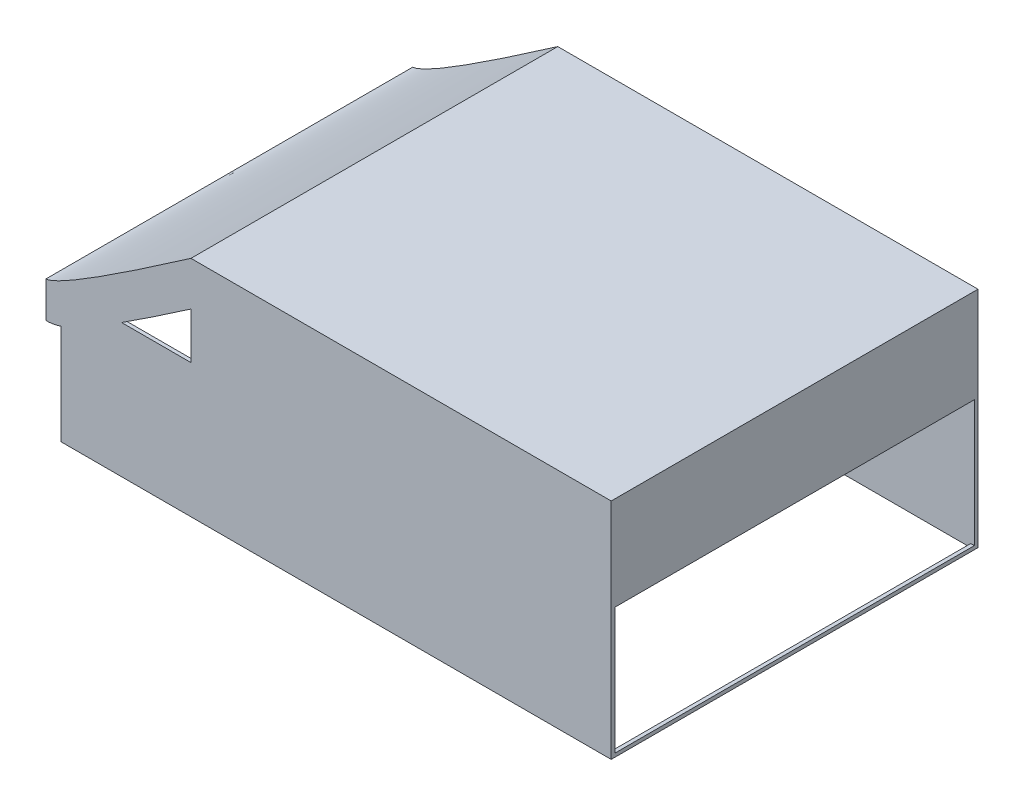
ISO-10303-21;
HEADER;
FILE_DESCRIPTION(('STEP AP214'),'2;1');
FILE_NAME('part.step','',(''),(''),'','','');
FILE_SCHEMA(('AUTOMOTIVE_DESIGN { 1 0 10303 214 1 1 1 1 }'));
ENDSEC;
DATA;
#1=APPLICATION_CONTEXT('core data for automotive mechanical design processes');
#2=APPLICATION_PROTOCOL_DEFINITION('international standard','automotive_design',2000,#1);
#3=PRODUCT_CONTEXT('',#1,'mechanical');
#4=PRODUCT('Part','Part','',(#3));
#5=PRODUCT_RELATED_PRODUCT_CATEGORY('part','',(#4));
#6=PRODUCT_DEFINITION_FORMATION('','',#4);
#7=PRODUCT_DEFINITION_CONTEXT('part definition',#1,'design');
#8=PRODUCT_DEFINITION('design','',#6,#7);
#9=PRODUCT_DEFINITION_SHAPE('','',#8);
#10=(LENGTH_UNIT() NAMED_UNIT(*) SI_UNIT(.MILLI.,.METRE.));
#11=(NAMED_UNIT(*) PLANE_ANGLE_UNIT() SI_UNIT($,.RADIAN.));
#12=(NAMED_UNIT(*) SI_UNIT($,.STERADIAN.) SOLID_ANGLE_UNIT());
#13=UNCERTAINTY_MEASURE_WITH_UNIT(LENGTH_MEASURE(1.E-05),#10,'distance_accuracy_value','');
#14=(GEOMETRIC_REPRESENTATION_CONTEXT(3) GLOBAL_UNCERTAINTY_ASSIGNED_CONTEXT((#13)) GLOBAL_UNIT_ASSIGNED_CONTEXT((#10,
#11,#12)) REPRESENTATION_CONTEXT('',''));
#15=CARTESIAN_POINT('',(0.,0.,0.));
#16=DIRECTION('',(0.,0.,1.));
#17=DIRECTION('',(1.,0.,0.));
#18=AXIS2_PLACEMENT_3D('',#15,#16,#17);
#19=CARTESIAN_POINT('',(-37.0766872794392,33.5,101.6));
#20=CARTESIAN_POINT('',(-42.7125032350059,29.6027559414298,101.6));
#21=CARTESIAN_POINT('',(-47.7401015171369,26.184011055158,101.6));
#22=CARTESIAN_POINT('',(-56.6002946408036,20.2910710982014,101.6));
#23=CARTESIAN_POINT('',(-60.4301900378997,17.8180585646791,101.6));
#24=CARTESIAN_POINT('',(-65.3309971448437,14.789830610659,101.6));
#25=CARTESIAN_POINT('',(-66.8241610539171,13.8937812196301,101.6));
#26=CARTESIAN_POINT('',(-69.5608772965481,12.3148053504962,101.6));
#27=CARTESIAN_POINT('',(-70.8015703462248,11.6324838821223,101.6));
#28=CARTESIAN_POINT('',(-72.5425145499101,10.7455673945844,101.6));
#29=CARTESIAN_POINT('',(-73.1032765211819,10.4724795735658,101.6));
#30=CARTESIAN_POINT('',(-74.2188237703371,9.96370439150966,101.6));
#31=CARTESIAN_POINT('',(-74.7719962388831,9.72783777312327,101.6));
#32=CARTESIAN_POINT('',(-75.6545097705938,9.39506547904827,101.6));
#33=CARTESIAN_POINT('',(-75.9579104070643,9.2876095564248,101.6));
#34=CARTESIAN_POINT('',(-76.6041667579753,9.07990325523925,101.6));
#35=CARTESIAN_POINT('',(-76.9466771282731,8.97943976358308,101.6));
#36=CARTESIAN_POINT('',(-77.7076101708116,8.79063089014684,101.6));
#37=CARTESIAN_POINT('',(-78.1254229662636,8.70154924601827,101.6));
#38=CARTESIAN_POINT('',(-79.1033064111244,8.55745716267692,101.6));
#39=CARTESIAN_POINT('',(-79.6630664683787,8.49999756803788,101.6));
#40=CARTESIAN_POINT('',(-80.3510854463625,8.4999973947017,101.6));
#41=B_SPLINE_CURVE_WITH_KNOTS('',3,(#19,#20,#21,#22,#23,#24,#25,#26,#27,#28,#29,#30,#31,#32,#33,
#34,#35,#36,#37,#38,#39,#40),.UNSPECIFIED.,.F.,.F.,(4,2,2,2,2,2,2,2,2,2,4),(0.,0.25,
0.499999999999999,0.624999999999999,0.749999999999999,0.812499999999999,0.874999999999999,
0.906249999999999,0.9375,0.96875,1.),.UNSPECIFIED.);
#42=DIRECTION('',(0.,0.,-1.));
#43=VECTOR('',#42,1.);
#44=SURFACE_OF_LINEAR_EXTRUSION('',#41,#43);
#45=CARTESIAN_POINT('',(-37.0766872794392,33.5,0.));
#46=CARTESIAN_POINT('',(-42.7125032350059,29.6027559414298,0.));
#47=CARTESIAN_POINT('',(-47.7401015171369,26.184011055158,0.));
#48=CARTESIAN_POINT('',(-56.6002946408036,20.2910710982014,0.));
#49=CARTESIAN_POINT('',(-60.4301900378997,17.8180585646791,0.));
#50=CARTESIAN_POINT('',(-65.3309971448437,14.789830610659,0.));
#51=CARTESIAN_POINT('',(-66.8241610539171,13.8937812196301,0.));
#52=CARTESIAN_POINT('',(-69.5608772965481,12.3148053504962,0.));
#53=CARTESIAN_POINT('',(-70.8015703462248,11.6324838821223,0.));
#54=CARTESIAN_POINT('',(-72.5425145499101,10.7455673945844,0.));
#55=CARTESIAN_POINT('',(-73.1032765211819,10.4724795735658,0.));
#56=CARTESIAN_POINT('',(-74.2188237703371,9.96370439150966,0.));
#57=CARTESIAN_POINT('',(-74.7719962388831,9.72783777312327,0.));
#58=CARTESIAN_POINT('',(-75.6545097705938,9.39506547904827,0.));
#59=CARTESIAN_POINT('',(-75.9579104070643,9.2876095564248,0.));
#60=CARTESIAN_POINT('',(-76.6041667579753,9.07990325523925,0.));
#61=CARTESIAN_POINT('',(-76.9466771282731,8.97943976358308,0.));
#62=CARTESIAN_POINT('',(-77.7076101708116,8.79063089014684,0.));
#63=CARTESIAN_POINT('',(-78.1254229662636,8.70154924601827,0.));
#64=CARTESIAN_POINT('',(-79.1033064111244,8.55745716267692,0.));
#65=CARTESIAN_POINT('',(-79.6630664683787,8.49999756803788,0.));
#66=CARTESIAN_POINT('',(-80.3510854463625,8.4999973947017,0.));
#67=B_SPLINE_CURVE_WITH_KNOTS('',3,(#45,#46,#47,#48,#49,#50,#51,#52,#53,#54,#55,#56,#57,#58,#59,
#60,#61,#62,#63,#64,#65,#66),.UNSPECIFIED.,.F.,.F.,(4,2,2,2,2,2,2,2,2,2,4),(0.,0.25,
0.499999999999999,0.624999999999999,0.749999999999999,0.812499999999999,0.874999999999999,
0.906249999999999,0.9375,0.96875,1.),.UNSPECIFIED.);
#68=CARTESIAN_POINT('',(-40.2031351826455,31.3442159922802,0.));
#69=VERTEX_POINT('',#68);
#70=CARTESIAN_POINT('',(-59.4122941054104,18.4999999999916,0.));
#71=VERTEX_POINT('',#70);
#72=EDGE_CURVE('E190',#69,#71,#67,.T.);
#73=ORIENTED_EDGE('',*,*,#72,.F.);
#74=DIRECTION('',(0.,0.,-1.));
#75=VECTOR('',#74,1.);
#76=CARTESIAN_POINT('',(-40.2031351826455,31.344215985583,101.6));
#77=LINE('',#76,#75);
#78=CARTESIAN_POINT('',(-40.2031351826455,31.3442159922802,101.6));
#79=VERTEX_POINT('',#78);
#80=EDGE_CURVE('E200',#69,#79,#77,.F.);
#81=ORIENTED_EDGE('',*,*,#80,.T.);
#82=CARTESIAN_POINT('',(-59.4122941054104,18.4999999999916,101.6));
#83=VERTEX_POINT('',#82);
#84=EDGE_CURVE('E430',#79,#83,#41,.T.);
#85=ORIENTED_EDGE('',*,*,#84,.T.);
#86=DIRECTION('',(0.,0.,-1.));
#87=VECTOR('',#86,1.);
#88=CARTESIAN_POINT('',(-59.4122941053973,18.5,101.6));
#89=LINE('',#88,#87);
#90=CARTESIAN_POINT('',(-59.4122941054104,18.5,100.6));
#91=VERTEX_POINT('',#90);
#92=EDGE_CURVE('E61',#91,#83,#89,.F.);
#93=ORIENTED_EDGE('',*,*,#92,.F.);
#94=CARTESIAN_POINT('',(-37.0766872794392,33.5,100.6));
#95=CARTESIAN_POINT('',(-42.7125032350059,29.6027559414298,100.6));
#96=CARTESIAN_POINT('',(-47.7401015171369,26.184011055158,100.6));
#97=CARTESIAN_POINT('',(-56.6002946408036,20.2910710982014,100.6));
#98=CARTESIAN_POINT('',(-60.4301900378997,17.8180585646791,100.6));
#99=CARTESIAN_POINT('',(-65.3309971448437,14.789830610659,100.6));
#100=CARTESIAN_POINT('',(-66.8241610539171,13.8937812196301,100.6));
#101=CARTESIAN_POINT('',(-69.5608772965481,12.3148053504962,100.6));
#102=CARTESIAN_POINT('',(-70.8015703462248,11.6324838821223,100.6));
#103=CARTESIAN_POINT('',(-72.5425145499101,10.7455673945844,100.6));
#104=CARTESIAN_POINT('',(-73.1032765211819,10.4724795735658,100.6));
#105=CARTESIAN_POINT('',(-74.2188237703371,9.96370439150966,100.6));
#106=CARTESIAN_POINT('',(-74.7719962388831,9.72783777312327,100.6));
#107=CARTESIAN_POINT('',(-75.6545097705938,9.39506547904827,100.6));
#108=CARTESIAN_POINT('',(-75.9579104070643,9.2876095564248,100.6));
#109=CARTESIAN_POINT('',(-76.6041667579753,9.07990325523925,100.6));
#110=CARTESIAN_POINT('',(-76.9466771282731,8.97943976358308,100.6));
#111=CARTESIAN_POINT('',(-77.7076101708116,8.79063089014684,100.6));
#112=CARTESIAN_POINT('',(-78.1254229662636,8.70154924601827,100.6));
#113=CARTESIAN_POINT('',(-79.1033064111244,8.55745716267692,100.6));
#114=CARTESIAN_POINT('',(-79.6630664683787,8.49999756803788,100.6));
#115=CARTESIAN_POINT('',(-80.3510854463625,8.4999973947017,100.6));
#116=B_SPLINE_CURVE_WITH_KNOTS('',3,(#94,#95,#96,#97,#98,#99,#100,#101,#102,#103,#104,#105,#106,
#107,#108,#109,#110,#111,#112,#113,#114,#115),.UNSPECIFIED.,.F.,.F.,(4,2,2,2,2,2,2,2,2,2,4),(0.,
0.25,0.499999999999999,0.624999999999999,0.749999999999999,0.812499999999999,0.874999999999999,
0.906249999999999,0.9375,0.96875,1.),.UNSPECIFIED.);
#117=CARTESIAN_POINT('',(-76.1999999997802,9.21001065409263,100.6));
#118=VERTEX_POINT('',#117);
#119=EDGE_CURVE('E11',#118,#91,#116,.F.);
#120=ORIENTED_EDGE('',*,*,#119,.F.);
#121=DIRECTION('',(0.,0.,-1.));
#122=VECTOR('',#121,1.);
#123=CARTESIAN_POINT('',(-76.1999999999956,9.2100106540223,101.6));
#124=LINE('',#123,#122);
#125=CARTESIAN_POINT('',(-76.1999999997802,9.21001065409262,101.6));
#126=VERTEX_POINT('',#125);
#127=EDGE_CURVE('E249',#126,#118,#124,.T.);
#128=ORIENTED_EDGE('',*,*,#127,.F.);
#129=CARTESIAN_POINT('',(-80.3510854463625,8.4999973947017,101.6));
#130=VERTEX_POINT('',#129);
#131=EDGE_CURVE('E196',#126,#130,#41,.T.);
#132=ORIENTED_EDGE('',*,*,#131,.T.);
#133=DIRECTION('',(0.,0.,-1.));
#134=VECTOR('',#133,1.);
#135=CARTESIAN_POINT('',(-80.3510854463625,8.4999973947017,101.6));
#136=LINE('',#135,#134);
#137=CARTESIAN_POINT('',(-80.3510854463625,8.4999973947017,0.));
#138=VERTEX_POINT('',#137);
#139=EDGE_CURVE('E244',#130,#138,#136,.T.);
#140=ORIENTED_EDGE('',*,*,#139,.T.);
#141=CARTESIAN_POINT('',(-76.1999999997802,9.21001065409262,0.));
#142=VERTEX_POINT('',#141);
#143=EDGE_CURVE('E205',#142,#138,#67,.T.);
#144=ORIENTED_EDGE('',*,*,#143,.F.);
#145=CARTESIAN_POINT('',(-76.2,9.21001065409263,1.));
#146=VERTEX_POINT('',#145);
#147=EDGE_CURVE('E54',#146,#142,#124,.T.);
#148=ORIENTED_EDGE('',*,*,#147,.F.);
#149=CARTESIAN_POINT('',(-37.0766872794392,33.5,1.));
#150=CARTESIAN_POINT('',(-42.7125032350059,29.6027559414298,1.));
#151=CARTESIAN_POINT('',(-47.7401015171369,26.184011055158,1.));
#152=CARTESIAN_POINT('',(-56.6002946408036,20.2910710982014,1.));
#153=CARTESIAN_POINT('',(-60.4301900378997,17.8180585646791,1.));
#154=CARTESIAN_POINT('',(-65.3309971448437,14.789830610659,1.));
#155=CARTESIAN_POINT('',(-66.8241610539171,13.8937812196301,1.));
#156=CARTESIAN_POINT('',(-69.5608772965481,12.3148053504962,1.));
#157=CARTESIAN_POINT('',(-70.8015703462248,11.6324838821223,1.));
#158=CARTESIAN_POINT('',(-72.5425145499101,10.7455673945844,1.));
#159=CARTESIAN_POINT('',(-73.1032765211819,10.4724795735658,1.));
#160=CARTESIAN_POINT('',(-74.2188237703371,9.96370439150966,1.));
#161=CARTESIAN_POINT('',(-74.7719962388831,9.72783777312327,1.));
#162=CARTESIAN_POINT('',(-75.6545097705938,9.39506547904827,1.));
#163=CARTESIAN_POINT('',(-75.9579104070643,9.2876095564248,1.));
#164=CARTESIAN_POINT('',(-76.6041667579753,9.07990325523925,1.));
#165=CARTESIAN_POINT('',(-76.9466771282731,8.97943976358308,1.));
#166=CARTESIAN_POINT('',(-77.7076101708116,8.79063089014684,1.));
#167=CARTESIAN_POINT('',(-78.1254229662636,8.70154924601827,1.));
#168=CARTESIAN_POINT('',(-79.1033064111244,8.55745716267692,1.));
#169=CARTESIAN_POINT('',(-79.6630664683787,8.49999756803788,1.));
#170=CARTESIAN_POINT('',(-80.3510854463625,8.4999973947017,1.));
#171=B_SPLINE_CURVE_WITH_KNOTS('',3,(#149,#150,#151,#152,#153,#154,#155,#156,#157,#158,#159,
#160,#161,#162,#163,#164,#165,#166,#167,#168,#169,#170),.UNSPECIFIED.,.F.,.F.,(4,2,2,2,2,2,2,2,
2,2,4),(0.,0.25,0.499999999999999,0.624999999999999,0.749999999999999,0.812499999999999,
0.874999999999999,0.906249999999999,0.9375,0.96875,1.),.UNSPECIFIED.);
#172=CARTESIAN_POINT('',(-59.4122941054104,18.4999999999916,1.));
#173=VERTEX_POINT('',#172);
#174=EDGE_CURVE('E252',#173,#146,#171,.T.);
#175=ORIENTED_EDGE('',*,*,#174,.F.);
#176=EDGE_CURVE('E208',#71,#173,#89,.F.);
#177=ORIENTED_EDGE('',*,*,#176,.F.);
#178=EDGE_LOOP('',(#73,#81,#85,#93,#120,#128,#132,#140,#144,#148,#175,#177));
#179=FACE_BOUND('',#178,.T.);
#180=ADVANCED_FACE('F37',(#179),#44,.T.);
#181=CARTESIAN_POINT('',(76.2,18.5,101.6));
#182=DIRECTION('',(0.,1.,0.));
#183=DIRECTION('',(0.,0.,1.));
#184=AXIS2_PLACEMENT_3D('',#181,#182,#183);
#185=PLANE('',#184);
#186=DIRECTION('',(0.,0.,-1.));
#187=VECTOR('',#186,1.);
#188=CARTESIAN_POINT('',(-40.2031351826455,18.5,101.6));
#189=LINE('',#188,#187);
#190=CARTESIAN_POINT('',(-40.2031351826455,18.5,100.6));
#191=VERTEX_POINT('',#190);
#192=CARTESIAN_POINT('',(-40.2031351826455,18.5,1.));
#193=VERTEX_POINT('',#192);
#194=EDGE_CURVE('E233',#191,#193,#189,.T.);
#195=ORIENTED_EDGE('',*,*,#194,.T.);
#196=DIRECTION('',(-1.,0.,0.));
#197=VECTOR('',#196,1.);
#198=CARTESIAN_POINT('',(75.2,18.5,1.));
#199=LINE('',#198,#197);
#200=CARTESIAN_POINT('',(75.2,18.5,0.999999999999996));
#201=VERTEX_POINT('',#200);
#202=EDGE_CURVE('E277',#201,#193,#199,.T.);
#203=ORIENTED_EDGE('',*,*,#202,.F.);
#204=DIRECTION('',(0.,0.,-1.));
#205=VECTOR('',#204,1.);
#206=CARTESIAN_POINT('',(75.2,18.5,1.));
#207=LINE('',#206,#205);
#208=CARTESIAN_POINT('',(75.2,18.5,100.6));
#209=VERTEX_POINT('',#208);
#210=EDGE_CURVE('E273',#209,#201,#207,.T.);
#211=ORIENTED_EDGE('',*,*,#210,.F.);
#212=DIRECTION('',(-1.,0.,0.));
#213=VECTOR('',#212,1.);
#214=CARTESIAN_POINT('',(76.2,18.5,100.6));
#215=LINE('',#214,#213);
#216=EDGE_CURVE('E232',#209,#191,#215,.T.);
#217=ORIENTED_EDGE('',*,*,#216,.T.);
#218=EDGE_LOOP('',(#195,#203,#211,#217));
#219=FACE_BOUND('',#218,.T.);
#220=ADVANCED_FACE('F402',(#219),#185,.F.);
#221=CARTESIAN_POINT('',(-40.2031351826455,28.5,101.6));
#222=DIRECTION('',(1.,0.,0.));
#223=DIRECTION('',(0.,0.,-1.));
#224=AXIS2_PLACEMENT_3D('',#221,#222,#223);
#225=PLANE('',#224);
#226=DIRECTION('',(0.,-1.,0.));
#227=VECTOR('',#226,1.);
#228=CARTESIAN_POINT('',(-40.2031351826455,28.5,0.));
#229=LINE('',#228,#227);
#230=CARTESIAN_POINT('',(-40.2031351826455,18.5,0.));
#231=VERTEX_POINT('',#230);
#232=EDGE_CURVE('E185',#69,#231,#229,.T.);
#233=ORIENTED_EDGE('',*,*,#232,.T.);
#234=EDGE_CURVE('E234',#193,#231,#189,.T.);
#235=ORIENTED_EDGE('',*,*,#234,.F.);
#236=ORIENTED_EDGE('',*,*,#194,.F.);
#237=CARTESIAN_POINT('',(-40.2031351826455,18.5,101.6));
#238=VERTEX_POINT('',#237);
#239=EDGE_CURVE('E229',#238,#191,#189,.T.);
#240=ORIENTED_EDGE('',*,*,#239,.F.);
#241=DIRECTION('',(0.,-1.,0.));
#242=VECTOR('',#241,1.);
#243=CARTESIAN_POINT('',(-40.2031351826455,28.5,101.6));
#244=LINE('',#243,#242);
#245=EDGE_CURVE('E203',#79,#238,#244,.T.);
#246=ORIENTED_EDGE('',*,*,#245,.F.);
#247=ORIENTED_EDGE('',*,*,#80,.F.);
#248=EDGE_LOOP('',(#233,#235,#236,#240,#246,#247));
#249=FACE_BOUND('',#248,.T.);
#250=ADVANCED_FACE('F201',(#249),#225,.F.);
#251=CARTESIAN_POINT('',(76.2,43.5,101.6));
#252=DIRECTION('',(0.,-1.,0.));
#253=DIRECTION('',(0.,0.,-1.));
#254=AXIS2_PLACEMENT_3D('',#251,#252,#253);
#255=PLANE('',#254);
#256=DIRECTION('',(-1.,0.,0.));
#257=VECTOR('',#256,1.);
#258=CARTESIAN_POINT('',(76.2,43.5,0.));
#259=LINE('',#258,#257);
#260=CARTESIAN_POINT('',(76.2,43.5,0.));
#261=VERTEX_POINT('',#260);
#262=CARTESIAN_POINT('',(-40.2031351826455,43.5,0.));
#263=VERTEX_POINT('',#262);
#264=EDGE_CURVE('E197',#261,#263,#259,.T.);
#265=ORIENTED_EDGE('',*,*,#264,.T.);
#266=DIRECTION('',(0.,0.,-1.));
#267=VECTOR('',#266,1.);
#268=CARTESIAN_POINT('',(-40.2031351826455,43.5,101.6));
#269=LINE('',#268,#267);
#270=CARTESIAN_POINT('',(-40.2031351826455,43.5,101.6));
#271=VERTEX_POINT('',#270);
#272=EDGE_CURVE('E238',#271,#263,#269,.T.);
#273=ORIENTED_EDGE('',*,*,#272,.F.);
#274=DIRECTION('',(-1.,0.,0.));
#275=VECTOR('',#274,1.);
#276=CARTESIAN_POINT('',(76.2,43.5,101.6));
#277=LINE('',#276,#275);
#278=CARTESIAN_POINT('',(76.2,43.5,101.6));
#279=VERTEX_POINT('',#278);
#280=EDGE_CURVE('E445',#279,#271,#277,.T.);
#281=ORIENTED_EDGE('',*,*,#280,.F.);
#282=DIRECTION('',(0.,0.,-1.));
#283=VECTOR('',#282,1.);
#284=CARTESIAN_POINT('',(76.2,43.5,101.6));
#285=LINE('',#284,#283);
#286=EDGE_CURVE('E235',#279,#261,#285,.T.);
#287=ORIENTED_EDGE('',*,*,#286,.T.);
#288=EDGE_LOOP('',(#265,#273,#281,#287));
#289=FACE_BOUND('',#288,.T.);
#290=ADVANCED_FACE('F452',(#289),#255,.F.);
#291=CARTESIAN_POINT('',(-40.2031351826455,43.5,101.6));
#292=CARTESIAN_POINT('',(-76.2000022454759,18.4999984405059,101.6));
#293=CARTESIAN_POINT('',(-80.3510879657142,18.4999973947014,101.6));
#294=B_SPLINE_CURVE_WITH_KNOTS('',2,(#291,#292,#293),.UNSPECIFIED.,.F.,.F.,(3,3),(0.,1.),.UNSPECIFIED.);
#295=DIRECTION('',(0.,0.,-1.));
#296=VECTOR('',#295,1.);
#297=SURFACE_OF_LINEAR_EXTRUSION('',#294,#296);
#298=CARTESIAN_POINT('',(-40.2031351826455,43.5,0.));
#299=CARTESIAN_POINT('',(-76.2000022454759,18.4999984405059,0.));
#300=CARTESIAN_POINT('',(-80.3510879657142,18.4999973947014,0.));
#301=B_SPLINE_CURVE_WITH_KNOTS('',2,(#298,#299,#300),.UNSPECIFIED.,.F.,.F.,(3,3),(0.,1.),.UNSPECIFIED.);
#302=CARTESIAN_POINT('',(-80.3510879657142,18.4999973947014,0.));
#303=VERTEX_POINT('',#302);
#304=EDGE_CURVE('E212',#263,#303,#301,.T.);
#305=ORIENTED_EDGE('',*,*,#304,.T.);
#306=DIRECTION('',(0.,0.,-1.));
#307=VECTOR('',#306,1.);
#308=CARTESIAN_POINT('',(-80.3510879657142,18.4999973947014,101.6));
#309=LINE('',#308,#307);
#310=CARTESIAN_POINT('',(-80.3510879657142,18.4999973947014,101.6));
#311=VERTEX_POINT('',#310);
#312=EDGE_CURVE('E241',#311,#303,#309,.T.);
#313=ORIENTED_EDGE('',*,*,#312,.F.);
#314=EDGE_CURVE('E441',#271,#311,#294,.T.);
#315=ORIENTED_EDGE('',*,*,#314,.F.);
#316=ORIENTED_EDGE('',*,*,#272,.T.);
#317=EDGE_LOOP('',(#305,#313,#315,#316));
#318=FACE_BOUND('',#317,.T.);
#319=ADVANCED_FACE('F449',(#318),#297,.F.);
#320=CARTESIAN_POINT('',(-80.3510879657142,18.4999973947014,101.6));
#321=DIRECTION('',(0.999999999999968,2.51935174111484E-07,0.));
#322=DIRECTION('',(-2.51935174111484E-07,0.999999999999968,0.));
#323=AXIS2_PLACEMENT_3D('',#320,#321,#322);
#324=PLANE('',#323);
#325=DIRECTION('',(2.51935174111484E-07,-0.999999999999968,0.));
#326=VECTOR('',#325,1.);
#327=CARTESIAN_POINT('',(-80.3510879657142,18.4999973947014,0.));
#328=LINE('',#327,#326);
#329=EDGE_CURVE('E209',#303,#138,#328,.T.);
#330=ORIENTED_EDGE('',*,*,#329,.T.);
#331=ORIENTED_EDGE('',*,*,#139,.F.);
#332=DIRECTION('',(2.51935174111484E-07,-0.999999999999968,0.));
#333=VECTOR('',#332,1.);
#334=CARTESIAN_POINT('',(-80.3510879657142,18.4999973947014,101.6));
#335=LINE('',#334,#333);
#336=EDGE_CURVE('E435',#311,#130,#335,.T.);
#337=ORIENTED_EDGE('',*,*,#336,.F.);
#338=ORIENTED_EDGE('',*,*,#312,.T.);
#339=EDGE_LOOP('',(#330,#331,#337,#338));
#340=FACE_BOUND('',#339,.T.);
#341=ADVANCED_FACE('F427',(#340),#324,.F.);
#342=CARTESIAN_POINT('',(-76.2,18.5,101.6));
#343=DIRECTION('',(0.,-1.,0.));
#344=DIRECTION('',(0.,0.,-1.));
#345=AXIS2_PLACEMENT_3D('',#342,#343,#344);
#346=PLANE('',#345);
#347=DIRECTION('',(-1.,0.,0.));
#348=VECTOR('',#347,1.);
#349=CARTESIAN_POINT('',(-76.2,18.5,0.));
#350=LINE('',#349,#348);
#351=EDGE_CURVE('E193',#231,#71,#350,.T.);
#352=ORIENTED_EDGE('',*,*,#351,.T.);
#353=ORIENTED_EDGE('',*,*,#176,.T.);
#354=EDGE_CURVE('E276',#193,#173,#199,.T.);
#355=ORIENTED_EDGE('',*,*,#354,.F.);
#356=ORIENTED_EDGE('',*,*,#234,.T.);
#357=EDGE_LOOP('',(#352,#353,#355,#356));
#358=FACE_BOUND('',#357,.T.);
#359=ADVANCED_FACE('F401',(#358),#346,.F.);
#360=DIRECTION('',(1.,0.,0.));
#361=VECTOR('',#360,1.);
#362=CARTESIAN_POINT('',(75.2,18.5,100.6));
#363=LINE('',#362,#361);
#364=EDGE_CURVE('E263',#91,#191,#363,.T.);
#365=ORIENTED_EDGE('',*,*,#364,.F.);
#366=ORIENTED_EDGE('',*,*,#92,.T.);
#367=DIRECTION('',(-1.,0.,0.));
#368=VECTOR('',#367,1.);
#369=CARTESIAN_POINT('',(-76.2,18.5,101.6));
#370=LINE('',#369,#368);
#371=EDGE_CURVE('E336',#238,#83,#370,.T.);
#372=ORIENTED_EDGE('',*,*,#371,.F.);
#373=ORIENTED_EDGE('',*,*,#239,.T.);
#374=EDGE_LOOP('',(#365,#366,#372,#373));
#375=FACE_BOUND('',#374,.T.);
#376=ADVANCED_FACE('F394',(#375),#346,.F.);
#377=CARTESIAN_POINT('',(76.2,17.5,1.));
#378=DIRECTION('',(0.,1.,0.));
#379=DIRECTION('',(0.,0.,1.));
#380=AXIS2_PLACEMENT_3D('',#377,#378,#379);
#381=PLANE('',#380);
#382=DIRECTION('',(-1.,0.,0.));
#383=VECTOR('',#382,1.);
#384=CARTESIAN_POINT('',(76.2,17.5,100.6));
#385=LINE('',#384,#383);
#386=CARTESIAN_POINT('',(76.2,17.5,100.6));
#387=VERTEX_POINT('',#386);
#388=CARTESIAN_POINT('',(75.2,17.5,100.6));
#389=VERTEX_POINT('',#388);
#390=EDGE_CURVE('E320',#387,#389,#385,.T.);
#391=ORIENTED_EDGE('',*,*,#390,.T.);
#392=DIRECTION('',(0.,0.,-1.));
#393=VECTOR('',#392,1.);
#394=CARTESIAN_POINT('',(75.2,17.5,1.));
#395=LINE('',#394,#393);
#396=CARTESIAN_POINT('',(75.2,17.5,1.));
#397=VERTEX_POINT('',#396);
#398=EDGE_CURVE('E284',#389,#397,#395,.T.);
#399=ORIENTED_EDGE('',*,*,#398,.T.);
#400=DIRECTION('',(-1.,0.,0.));
#401=VECTOR('',#400,1.);
#402=CARTESIAN_POINT('',(76.2,17.5,1.));
#403=LINE('',#402,#401);
#404=CARTESIAN_POINT('',(76.2,17.5,1.));
#405=VERTEX_POINT('',#404);
#406=EDGE_CURVE('E316',#405,#397,#403,.T.);
#407=ORIENTED_EDGE('',*,*,#406,.F.);
#408=DIRECTION('',(0.,0.,-1.));
#409=VECTOR('',#408,1.);
#410=CARTESIAN_POINT('',(76.2,17.5,1.));
#411=LINE('',#410,#409);
#412=EDGE_CURVE('E306',#387,#405,#411,.T.);
#413=ORIENTED_EDGE('',*,*,#412,.F.);
#414=EDGE_LOOP('',(#391,#399,#407,#413));
#415=FACE_BOUND('',#414,.T.);
#416=ADVANCED_FACE('F407',(#415),#381,.F.);
#417=CARTESIAN_POINT('',(76.2,-17.5,1.));
#418=DIRECTION('',(0.,-1.,0.));
#419=DIRECTION('',(0.,0.,-1.));
#420=AXIS2_PLACEMENT_3D('',#417,#418,#419);
#421=PLANE('',#420);
#422=DIRECTION('',(-1.,0.,0.));
#423=VECTOR('',#422,1.);
#424=CARTESIAN_POINT('',(76.2,-17.5,1.));
#425=LINE('',#424,#423);
#426=CARTESIAN_POINT('',(76.2,-17.5,1.));
#427=VERTEX_POINT('',#426);
#428=CARTESIAN_POINT('',(75.2,-17.5,1.));
#429=VERTEX_POINT('',#428);
#430=EDGE_CURVE('E327',#427,#429,#425,.T.);
#431=ORIENTED_EDGE('',*,*,#430,.T.);
#432=DIRECTION('',(0.,0.,1.));
#433=VECTOR('',#432,1.);
#434=CARTESIAN_POINT('',(75.2,-17.5,1.));
#435=LINE('',#434,#433);
#436=CARTESIAN_POINT('',(75.2,-17.5,100.6));
#437=VERTEX_POINT('',#436);
#438=EDGE_CURVE('E47',#429,#437,#435,.T.);
#439=ORIENTED_EDGE('',*,*,#438,.T.);
#440=DIRECTION('',(-1.,0.,0.));
#441=VECTOR('',#440,1.);
#442=CARTESIAN_POINT('',(76.2,-17.5,100.6));
#443=LINE('',#442,#441);
#444=CARTESIAN_POINT('',(76.2,-17.5,100.6));
#445=VERTEX_POINT('',#444);
#446=EDGE_CURVE('E323',#445,#437,#443,.T.);
#447=ORIENTED_EDGE('',*,*,#446,.F.);
#448=DIRECTION('',(0.,0.,1.));
#449=VECTOR('',#448,1.);
#450=CARTESIAN_POINT('',(76.2,-17.5,1.));
#451=LINE('',#450,#449);
#452=EDGE_CURVE('E299',#427,#445,#451,.T.);
#453=ORIENTED_EDGE('',*,*,#452,.F.);
#454=EDGE_LOOP('',(#431,#439,#447,#453));
#455=FACE_BOUND('',#454,.T.);
#456=ADVANCED_FACE('F357',(#455),#421,.F.);
#457=CARTESIAN_POINT('',(-76.2,18.5,101.6));
#458=DIRECTION('',(1.,0.,0.));
#459=DIRECTION('',(0.,0.,-1.));
#460=AXIS2_PLACEMENT_3D('',#457,#458,#459);
#461=PLANE('',#460);
#462=DIRECTION('',(0.,-1.,0.));
#463=VECTOR('',#462,1.);
#464=CARTESIAN_POINT('',(-76.2,18.5,101.6));
#465=LINE('',#464,#463);
#466=CARTESIAN_POINT('',(-76.2,-18.5,101.6));
#467=VERTEX_POINT('',#466);
#468=EDGE_CURVE('E330',#126,#467,#465,.T.);
#469=ORIENTED_EDGE('',*,*,#468,.F.);
#470=ORIENTED_EDGE('',*,*,#127,.T.);
#471=DIRECTION('',(0.,1.,0.));
#472=VECTOR('',#471,1.);
#473=CARTESIAN_POINT('',(-76.2,17.5,100.6));
#474=LINE('',#473,#472);
#475=CARTESIAN_POINT('',(-76.2,-17.5,100.6));
#476=VERTEX_POINT('',#475);
#477=EDGE_CURVE('E300',#476,#118,#474,.T.);
#478=ORIENTED_EDGE('',*,*,#477,.F.);
#479=DIRECTION('',(0.,0.,1.));
#480=VECTOR('',#479,1.);
#481=CARTESIAN_POINT('',(-76.2,-17.5,1.));
#482=LINE('',#481,#480);
#483=CARTESIAN_POINT('',(-76.2,-17.5,1.));
#484=VERTEX_POINT('',#483);
#485=EDGE_CURVE('E311',#484,#476,#482,.T.);
#486=ORIENTED_EDGE('',*,*,#485,.F.);
#487=DIRECTION('',(0.,-1.,0.));
#488=VECTOR('',#487,1.);
#489=CARTESIAN_POINT('',(-76.2,17.5,1.));
#490=LINE('',#489,#488);
#491=EDGE_CURVE('E295',#146,#484,#490,.T.);
#492=ORIENTED_EDGE('',*,*,#491,.F.);
#493=ORIENTED_EDGE('',*,*,#147,.T.);
#494=DIRECTION('',(0.,-1.,0.));
#495=VECTOR('',#494,1.);
#496=CARTESIAN_POINT('',(-76.2,18.5,0.));
#497=LINE('',#496,#495);
#498=CARTESIAN_POINT('',(-76.2,-18.5,0.));
#499=VERTEX_POINT('',#498);
#500=EDGE_CURVE('E319',#142,#499,#497,.T.);
#501=ORIENTED_EDGE('',*,*,#500,.T.);
#502=DIRECTION('',(0.,0.,-1.));
#503=VECTOR('',#502,1.);
#504=CARTESIAN_POINT('',(-76.2,-18.5,101.6));
#505=LINE('',#504,#503);
#506=EDGE_CURVE('E348',#467,#499,#505,.T.);
#507=ORIENTED_EDGE('',*,*,#506,.F.);
#508=EDGE_LOOP('',(#469,#470,#478,#486,#492,#493,#501,#507));
#509=FACE_BOUND('',#508,.T.);
#510=ADVANCED_FACE('F39',(#509),#461,.F.);
#511=CARTESIAN_POINT('',(-76.2,-18.5,101.6));
#512=DIRECTION('',(0.,1.,0.));
#513=DIRECTION('',(-1.,0.,0.));
#514=AXIS2_PLACEMENT_3D('',#511,#512,#513);
#515=PLANE('',#514);
#516=DIRECTION('',(1.,0.,0.));
#517=VECTOR('',#516,1.);
#518=CARTESIAN_POINT('',(75.2,-18.5,100.6));
#519=LINE('',#518,#517);
#520=CARTESIAN_POINT('',(-75.2,-18.5,100.6));
#521=VERTEX_POINT('',#520);
#522=CARTESIAN_POINT('',(75.2,-18.5,100.6));
#523=VERTEX_POINT('',#522);
#524=EDGE_CURVE('E269',#521,#523,#519,.T.);
#525=ORIENTED_EDGE('',*,*,#524,.T.);
#526=DIRECTION('',(0.,0.,-1.));
#527=VECTOR('',#526,1.);
#528=CARTESIAN_POINT('',(75.2,-18.5,1.));
#529=LINE('',#528,#527);
#530=CARTESIAN_POINT('',(75.2,-18.5,1.));
#531=VERTEX_POINT('',#530);
#532=EDGE_CURVE('E256',#523,#531,#529,.T.);
#533=ORIENTED_EDGE('',*,*,#532,.T.);
#534=DIRECTION('',(-1.,0.,0.));
#535=VECTOR('',#534,1.);
#536=CARTESIAN_POINT('',(75.2,-18.5,1.));
#537=LINE('',#536,#535);
#538=CARTESIAN_POINT('',(-75.2,-18.5,1.00000000000001));
#539=VERTEX_POINT('',#538);
#540=EDGE_CURVE('E262',#531,#539,#537,.T.);
#541=ORIENTED_EDGE('',*,*,#540,.T.);
#542=DIRECTION('',(0.,0.,1.));
#543=VECTOR('',#542,1.);
#544=CARTESIAN_POINT('',(-75.2,-18.5,1.00000000000002));
#545=LINE('',#544,#543);
#546=EDGE_CURVE('E266',#539,#521,#545,.T.);
#547=ORIENTED_EDGE('',*,*,#546,.T.);
#548=EDGE_LOOP('',(#525,#533,#541,#547));
#549=FACE_BOUND('',#548,.T.);
#550=DIRECTION('',(1.,0.,0.));
#551=VECTOR('',#550,1.);
#552=CARTESIAN_POINT('',(-76.2,-18.5,0.));
#553=LINE('',#552,#551);
#554=CARTESIAN_POINT('',(76.2,-18.5,0.));
#555=VERTEX_POINT('',#554);
#556=EDGE_CURVE('E341',#499,#555,#553,.T.);
#557=ORIENTED_EDGE('',*,*,#556,.T.);
#558=DIRECTION('',(0.,0.,-1.));
#559=VECTOR('',#558,1.);
#560=CARTESIAN_POINT('',(76.2,-18.5,101.6));
#561=LINE('',#560,#559);
#562=CARTESIAN_POINT('',(76.2,-18.5,101.6));
#563=VERTEX_POINT('',#562);
#564=EDGE_CURVE('E339',#563,#555,#561,.T.);
#565=ORIENTED_EDGE('',*,*,#564,.F.);
#566=DIRECTION('',(1.,0.,0.));
#567=VECTOR('',#566,1.);
#568=CARTESIAN_POINT('',(-76.2,-18.5,101.6));
#569=LINE('',#568,#567);
#570=EDGE_CURVE('E332',#467,#563,#569,.T.);
#571=ORIENTED_EDGE('',*,*,#570,.F.);
#572=ORIENTED_EDGE('',*,*,#506,.T.);
#573=EDGE_LOOP('',(#557,#565,#571,#572));
#574=FACE_BOUND('',#573,.T.);
#575=ADVANCED_FACE('F378',(#549,#574),#515,.F.);
#576=CARTESIAN_POINT('',(76.2,18.5,101.6));
#577=DIRECTION('',(-1.,0.,0.));
#578=DIRECTION('',(0.,0.,1.));
#579=AXIS2_PLACEMENT_3D('',#576,#577,#578);
#580=PLANE('',#579);
#581=ORIENTED_EDGE('',*,*,#412,.T.);
#582=DIRECTION('',(0.,-1.,0.));
#583=VECTOR('',#582,1.);
#584=CARTESIAN_POINT('',(76.2,17.5,1.));
#585=LINE('',#584,#583);
#586=EDGE_CURVE('E296',#405,#427,#585,.T.);
#587=ORIENTED_EDGE('',*,*,#586,.T.);
#588=ORIENTED_EDGE('',*,*,#452,.T.);
#589=DIRECTION('',(0.,1.,0.));
#590=VECTOR('',#589,1.);
#591=CARTESIAN_POINT('',(76.2,17.5,100.6));
#592=LINE('',#591,#590);
#593=EDGE_CURVE('E303',#445,#387,#592,.T.);
#594=ORIENTED_EDGE('',*,*,#593,.T.);
#595=EDGE_LOOP('',(#581,#587,#588,#594));
#596=FACE_BOUND('',#595,.T.);
#597=DIRECTION('',(0.,1.,0.));
#598=VECTOR('',#597,1.);
#599=CARTESIAN_POINT('',(76.2,18.5,0.));
#600=LINE('',#599,#598);
#601=EDGE_CURVE('E343',#555,#261,#600,.T.);
#602=ORIENTED_EDGE('',*,*,#601,.T.);
#603=ORIENTED_EDGE('',*,*,#286,.F.);
#604=DIRECTION('',(0.,1.,0.));
#605=VECTOR('',#604,1.);
#606=CARTESIAN_POINT('',(76.2,18.5,101.6));
#607=LINE('',#606,#605);
#608=EDGE_CURVE('E334',#563,#279,#607,.T.);
#609=ORIENTED_EDGE('',*,*,#608,.F.);
#610=ORIENTED_EDGE('',*,*,#564,.T.);
#611=EDGE_LOOP('',(#602,#603,#609,#610));
#612=FACE_BOUND('',#611,.T.);
#613=ADVANCED_FACE('F367',(#596,#612),#580,.F.);
#614=CARTESIAN_POINT('',(0.,0.,101.6));
#615=DIRECTION('',(0.,0.,1.));
#616=DIRECTION('',(1.,0.,0.));
#617=AXIS2_PLACEMENT_3D('',#614,#615,#616);
#618=PLANE('',#617);
#619=ORIENTED_EDGE('',*,*,#84,.F.);
#620=ORIENTED_EDGE('',*,*,#245,.T.);
#621=ORIENTED_EDGE('',*,*,#371,.T.);
#622=EDGE_LOOP('',(#619,#620,#621));
#623=FACE_BOUND('',#622,.T.);
#624=ORIENTED_EDGE('',*,*,#131,.F.);
#625=ORIENTED_EDGE('',*,*,#468,.T.);
#626=ORIENTED_EDGE('',*,*,#570,.T.);
#627=ORIENTED_EDGE('',*,*,#608,.T.);
#628=ORIENTED_EDGE('',*,*,#280,.T.);
#629=ORIENTED_EDGE('',*,*,#314,.T.);
#630=ORIENTED_EDGE('',*,*,#336,.T.);
#631=EDGE_LOOP('',(#624,#625,#626,#627,#628,#629,#630));
#632=FACE_BOUND('',#631,.T.);
#633=ADVANCED_FACE('F505',(#623,#632),#618,.T.);
#634=CARTESIAN_POINT('',(0.,0.,0.));
#635=DIRECTION('',(0.,0.,1.));
#636=DIRECTION('',(1.,0.,0.));
#637=AXIS2_PLACEMENT_3D('',#634,#635,#636);
#638=PLANE('',#637);
#639=ORIENTED_EDGE('',*,*,#232,.F.);
#640=ORIENTED_EDGE('',*,*,#72,.T.);
#641=ORIENTED_EDGE('',*,*,#351,.F.);
#642=EDGE_LOOP('',(#639,#640,#641));
#643=FACE_BOUND('',#642,.T.);
#644=ORIENTED_EDGE('',*,*,#500,.F.);
#645=ORIENTED_EDGE('',*,*,#143,.T.);
#646=ORIENTED_EDGE('',*,*,#329,.F.);
#647=ORIENTED_EDGE('',*,*,#304,.F.);
#648=ORIENTED_EDGE('',*,*,#264,.F.);
#649=ORIENTED_EDGE('',*,*,#601,.F.);
#650=ORIENTED_EDGE('',*,*,#556,.F.);
#651=EDGE_LOOP('',(#644,#645,#646,#647,#648,#649,#650));
#652=FACE_BOUND('',#651,.T.);
#653=ADVANCED_FACE('F187',(#643,#652),#638,.F.);
#654=CARTESIAN_POINT('',(76.2,17.5,1.));
#655=DIRECTION('',(0.,0.,-1.));
#656=DIRECTION('',(0.,1.,0.));
#657=AXIS2_PLACEMENT_3D('',#654,#655,#656);
#658=PLANE('',#657);
#659=ORIENTED_EDGE('',*,*,#354,.T.);
#660=ORIENTED_EDGE('',*,*,#174,.T.);
#661=ORIENTED_EDGE('',*,*,#491,.T.);
#662=CARTESIAN_POINT('',(-75.2,-17.5,1.00000000000002));
#663=VERTEX_POINT('',#662);
#664=EDGE_CURVE('E309',#663,#484,#425,.T.);
#665=ORIENTED_EDGE('',*,*,#664,.F.);
#666=DIRECTION('',(0.,1.,0.));
#667=VECTOR('',#666,1.);
#668=CARTESIAN_POINT('',(-75.2,-18.5,1.00000000000002));
#669=LINE('',#668,#667);
#670=EDGE_CURVE('E289',#539,#663,#669,.T.);
#671=ORIENTED_EDGE('',*,*,#670,.F.);
#672=ORIENTED_EDGE('',*,*,#540,.F.);
#673=DIRECTION('',(0.,1.,0.));
#674=VECTOR('',#673,1.);
#675=CARTESIAN_POINT('',(75.2,-18.5,1.));
#676=LINE('',#675,#674);
#677=EDGE_CURVE('E291',#531,#429,#676,.T.);
#678=ORIENTED_EDGE('',*,*,#677,.T.);
#679=ORIENTED_EDGE('',*,*,#430,.F.);
#680=ORIENTED_EDGE('',*,*,#586,.F.);
#681=ORIENTED_EDGE('',*,*,#406,.T.);
#682=EDGE_CURVE('E272',#397,#201,#676,.T.);
#683=ORIENTED_EDGE('',*,*,#682,.T.);
#684=ORIENTED_EDGE('',*,*,#202,.T.);
#685=EDGE_LOOP('',(#659,#660,#661,#665,#671,#672,#678,#679,#680,#681,#683,#684));
#686=FACE_BOUND('',#685,.T.);
#687=ADVANCED_FACE('F372',(#686),#658,.F.);
#688=CARTESIAN_POINT('',(76.2,17.5,100.6));
#689=DIRECTION('',(0.,0.,1.));
#690=DIRECTION('',(1.,0.,0.));
#691=AXIS2_PLACEMENT_3D('',#688,#689,#690);
#692=PLANE('',#691);
#693=ORIENTED_EDGE('',*,*,#477,.T.);
#694=ORIENTED_EDGE('',*,*,#119,.T.);
#695=ORIENTED_EDGE('',*,*,#364,.T.);
#696=ORIENTED_EDGE('',*,*,#216,.F.);
#697=DIRECTION('',(0.,1.,0.));
#698=VECTOR('',#697,1.);
#699=CARTESIAN_POINT('',(75.2,-18.5,100.6));
#700=LINE('',#699,#698);
#701=EDGE_CURVE('E285',#389,#209,#700,.T.);
#702=ORIENTED_EDGE('',*,*,#701,.F.);
#703=ORIENTED_EDGE('',*,*,#390,.F.);
#704=ORIENTED_EDGE('',*,*,#593,.F.);
#705=ORIENTED_EDGE('',*,*,#446,.T.);
#706=EDGE_CURVE('E282',#523,#437,#700,.T.);
#707=ORIENTED_EDGE('',*,*,#706,.F.);
#708=ORIENTED_EDGE('',*,*,#524,.F.);
#709=DIRECTION('',(0.,1.,0.));
#710=VECTOR('',#709,1.);
#711=CARTESIAN_POINT('',(-75.2,-18.5,100.6));
#712=LINE('',#711,#710);
#713=CARTESIAN_POINT('',(-75.2,-17.5,100.6));
#714=VERTEX_POINT('',#713);
#715=EDGE_CURVE('E286',#521,#714,#712,.T.);
#716=ORIENTED_EDGE('',*,*,#715,.T.);
#717=EDGE_CURVE('E326',#714,#476,#443,.T.);
#718=ORIENTED_EDGE('',*,*,#717,.T.);
#719=EDGE_LOOP('',(#693,#694,#695,#696,#702,#703,#704,#705,#707,#708,#716,#718));
#720=FACE_BOUND('',#719,.T.);
#721=ADVANCED_FACE('F361',(#720),#692,.F.);
#722=ORIENTED_EDGE('',*,*,#717,.F.);
#723=DIRECTION('',(0.,0.,-1.));
#724=VECTOR('',#723,1.);
#725=CARTESIAN_POINT('',(-75.2,-17.5,0.999999999999983));
#726=LINE('',#725,#724);
#727=EDGE_CURVE('E351',#714,#663,#726,.T.);
#728=ORIENTED_EDGE('',*,*,#727,.T.);
#729=ORIENTED_EDGE('',*,*,#664,.T.);
#730=ORIENTED_EDGE('',*,*,#485,.T.);
#731=EDGE_LOOP('',(#722,#728,#729,#730));
#732=FACE_BOUND('',#731,.T.);
#733=ADVANCED_FACE('F383',(#732),#421,.F.);
#734=CARTESIAN_POINT('',(-75.2,-18.5,1.00000000000002));
#735=DIRECTION('',(-1.,0.,0.));
#736=DIRECTION('',(0.,0.,1.));
#737=AXIS2_PLACEMENT_3D('',#734,#735,#736);
#738=PLANE('',#737);
#739=ORIENTED_EDGE('',*,*,#715,.F.);
#740=ORIENTED_EDGE('',*,*,#546,.F.);
#741=ORIENTED_EDGE('',*,*,#670,.T.);
#742=ORIENTED_EDGE('',*,*,#727,.F.);
#743=EDGE_LOOP('',(#739,#740,#741,#742));
#744=FACE_BOUND('',#743,.T.);
#745=ADVANCED_FACE('F429',(#744),#738,.F.);
#746=CARTESIAN_POINT('',(75.2,-18.5,1.));
#747=DIRECTION('',(1.,0.,0.));
#748=DIRECTION('',(0.,0.,-1.));
#749=AXIS2_PLACEMENT_3D('',#746,#747,#748);
#750=PLANE('',#749);
#751=ORIENTED_EDGE('',*,*,#677,.F.);
#752=ORIENTED_EDGE('',*,*,#532,.F.);
#753=ORIENTED_EDGE('',*,*,#706,.T.);
#754=ORIENTED_EDGE('',*,*,#438,.F.);
#755=EDGE_LOOP('',(#751,#752,#753,#754));
#756=FACE_BOUND('',#755,.T.);
#757=ADVANCED_FACE('F376',(#756),#750,.F.);
#758=ORIENTED_EDGE('',*,*,#701,.T.);
#759=ORIENTED_EDGE('',*,*,#210,.T.);
#760=ORIENTED_EDGE('',*,*,#682,.F.);
#761=ORIENTED_EDGE('',*,*,#398,.F.);
#762=EDGE_LOOP('',(#758,#759,#760,#761));
#763=FACE_BOUND('',#762,.T.);
#764=ADVANCED_FACE('F405',(#763),#750,.F.);
#765=CLOSED_SHELL('',(#180,#220,#250,#290,#319,#341,#359,#376,#416,#456,#510,#575,#613,#633,
#653,#687,#721,#733,#745,#757,#764));
#766=MANIFOLD_SOLID_BREP('B2',#765);
#767=ADVANCED_BREP_SHAPE_REPRESENTATION('',(#18,#766),#14);
#768=SHAPE_DEFINITION_REPRESENTATION(#9,#767);
ENDSEC;
END-ISO-10303-21;
